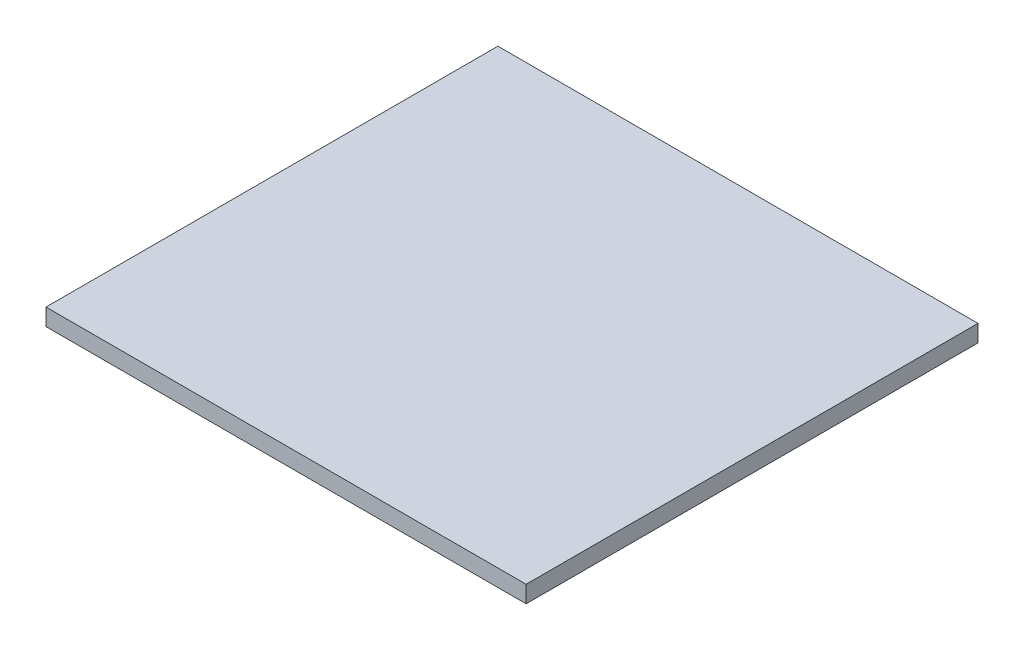
ISO-10303-21;
HEADER;
FILE_DESCRIPTION(('STEP AP214'),'2;1');
FILE_NAME('part.step','',(''),(''),'','','');
FILE_SCHEMA(('AUTOMOTIVE_DESIGN { 1 0 10303 214 1 1 1 1 }'));
ENDSEC;
DATA;
#1=APPLICATION_CONTEXT('core data for automotive mechanical design processes');
#2=APPLICATION_PROTOCOL_DEFINITION('international standard','automotive_design',2000,#1);
#3=PRODUCT_CONTEXT('',#1,'mechanical');
#4=PRODUCT('Part','Part','',(#3));
#5=PRODUCT_RELATED_PRODUCT_CATEGORY('part','',(#4));
#6=PRODUCT_DEFINITION_FORMATION('','',#4);
#7=PRODUCT_DEFINITION_CONTEXT('part definition',#1,'design');
#8=PRODUCT_DEFINITION('design','',#6,#7);
#9=PRODUCT_DEFINITION_SHAPE('','',#8);
#10=(LENGTH_UNIT() NAMED_UNIT(*) SI_UNIT(.MILLI.,.METRE.));
#11=(NAMED_UNIT(*) PLANE_ANGLE_UNIT() SI_UNIT($,.RADIAN.));
#12=(NAMED_UNIT(*) SI_UNIT($,.STERADIAN.) SOLID_ANGLE_UNIT());
#13=UNCERTAINTY_MEASURE_WITH_UNIT(LENGTH_MEASURE(1.E-05),#10,'distance_accuracy_value','');
#14=(GEOMETRIC_REPRESENTATION_CONTEXT(3) GLOBAL_UNCERTAINTY_ASSIGNED_CONTEXT((#13)) GLOBAL_UNIT_ASSIGNED_CONTEXT((#10,
#11,#12)) REPRESENTATION_CONTEXT('',''));
#15=CARTESIAN_POINT('',(0.,0.,0.));
#16=DIRECTION('',(0.,0.,1.));
#17=DIRECTION('',(1.,0.,0.));
#18=AXIS2_PLACEMENT_3D('',#15,#16,#17);
#19=CARTESIAN_POINT('',(-42.5,3.,-40.));
#20=DIRECTION('',(1.,0.,0.));
#21=DIRECTION('',(0.,0.,-1.));
#22=AXIS2_PLACEMENT_3D('',#19,#20,#21);
#23=PLANE('',#22);
#24=DIRECTION('',(0.,0.,1.));
#25=VECTOR('',#24,1.);
#26=CARTESIAN_POINT('',(-42.5,0.,-40.));
#27=LINE('',#26,#25);
#28=CARTESIAN_POINT('',(-42.5,0.,-40.));
#29=VERTEX_POINT('',#28);
#30=CARTESIAN_POINT('',(-42.5,0.,40.));
#31=VERTEX_POINT('',#30);
#32=EDGE_CURVE('E100',#29,#31,#27,.T.);
#33=ORIENTED_EDGE('',*,*,#32,.T.);
#34=DIRECTION('',(0.,-1.,0.));
#35=VECTOR('',#34,1.);
#36=CARTESIAN_POINT('',(-42.5,3.,40.));
#37=LINE('',#36,#35);
#38=CARTESIAN_POINT('',(-42.5,3.,40.));
#39=VERTEX_POINT('',#38);
#40=EDGE_CURVE('E11',#39,#31,#37,.T.);
#41=ORIENTED_EDGE('',*,*,#40,.F.);
#42=DIRECTION('',(0.,0.,1.));
#43=VECTOR('',#42,1.);
#44=CARTESIAN_POINT('',(-42.5,3.,-40.));
#45=LINE('',#44,#43);
#46=CARTESIAN_POINT('',(-42.5,3.,-40.));
#47=VERTEX_POINT('',#46);
#48=EDGE_CURVE('E88',#47,#39,#45,.T.);
#49=ORIENTED_EDGE('',*,*,#48,.F.);
#50=DIRECTION('',(0.,-1.,0.));
#51=VECTOR('',#50,1.);
#52=CARTESIAN_POINT('',(-42.5,3.,-40.));
#53=LINE('',#52,#51);
#54=EDGE_CURVE('E96',#47,#29,#53,.T.);
#55=ORIENTED_EDGE('',*,*,#54,.T.);
#56=EDGE_LOOP('',(#33,#41,#49,#55));
#57=FACE_BOUND('',#56,.T.);
#58=ADVANCED_FACE('F37',(#57),#23,.F.);
#59=CARTESIAN_POINT('',(42.5,3.,40.));
#60=DIRECTION('',(0.,0.,-1.));
#61=DIRECTION('',(-1.,0.,0.));
#62=AXIS2_PLACEMENT_3D('',#59,#60,#61);
#63=PLANE('',#62);
#64=DIRECTION('',(1.,0.,0.));
#65=VECTOR('',#64,1.);
#66=CARTESIAN_POINT('',(42.5,0.,40.));
#67=LINE('',#66,#65);
#68=CARTESIAN_POINT('',(42.5,0.,40.));
#69=VERTEX_POINT('',#68);
#70=EDGE_CURVE('E92',#31,#69,#67,.T.);
#71=ORIENTED_EDGE('',*,*,#70,.T.);
#72=DIRECTION('',(0.,-1.,0.));
#73=VECTOR('',#72,1.);
#74=CARTESIAN_POINT('',(42.5,3.,40.));
#75=LINE('',#74,#73);
#76=CARTESIAN_POINT('',(42.5,3.,40.));
#77=VERTEX_POINT('',#76);
#78=EDGE_CURVE('E45',#77,#69,#75,.T.);
#79=ORIENTED_EDGE('',*,*,#78,.F.);
#80=DIRECTION('',(1.,0.,0.));
#81=VECTOR('',#80,1.);
#82=CARTESIAN_POINT('',(42.5,3.,40.));
#83=LINE('',#82,#81);
#84=EDGE_CURVE('E83',#39,#77,#83,.T.);
#85=ORIENTED_EDGE('',*,*,#84,.F.);
#86=ORIENTED_EDGE('',*,*,#40,.T.);
#87=EDGE_LOOP('',(#71,#79,#85,#86));
#88=FACE_BOUND('',#87,.T.);
#89=ADVANCED_FACE('F91',(#88),#63,.F.);
#90=CARTESIAN_POINT('',(42.5,3.,-40.));
#91=DIRECTION('',(-1.,0.,0.));
#92=DIRECTION('',(0.,0.,1.));
#93=AXIS2_PLACEMENT_3D('',#90,#91,#92);
#94=PLANE('',#93);
#95=DIRECTION('',(0.,0.,-1.));
#96=VECTOR('',#95,1.);
#97=CARTESIAN_POINT('',(42.5,0.,-40.));
#98=LINE('',#97,#96);
#99=CARTESIAN_POINT('',(42.5,0.,-40.));
#100=VERTEX_POINT('',#99);
#101=EDGE_CURVE('E70',#69,#100,#98,.T.);
#102=ORIENTED_EDGE('',*,*,#101,.T.);
#103=DIRECTION('',(0.,-1.,0.));
#104=VECTOR('',#103,1.);
#105=CARTESIAN_POINT('',(42.5,3.,-40.));
#106=LINE('',#105,#104);
#107=CARTESIAN_POINT('',(42.5,3.,-40.));
#108=VERTEX_POINT('',#107);
#109=EDGE_CURVE('E93',#108,#100,#106,.T.);
#110=ORIENTED_EDGE('',*,*,#109,.F.);
#111=DIRECTION('',(0.,0.,-1.));
#112=VECTOR('',#111,1.);
#113=CARTESIAN_POINT('',(42.5,3.,-40.));
#114=LINE('',#113,#112);
#115=EDGE_CURVE('E86',#77,#108,#114,.T.);
#116=ORIENTED_EDGE('',*,*,#115,.F.);
#117=ORIENTED_EDGE('',*,*,#78,.T.);
#118=EDGE_LOOP('',(#102,#110,#116,#117));
#119=FACE_BOUND('',#118,.T.);
#120=ADVANCED_FACE('F94',(#119),#94,.F.);
#121=CARTESIAN_POINT('',(42.5,3.,-40.));
#122=DIRECTION('',(0.,0.,1.));
#123=DIRECTION('',(1.,0.,0.));
#124=AXIS2_PLACEMENT_3D('',#121,#122,#123);
#125=PLANE('',#124);
#126=DIRECTION('',(-1.,0.,0.));
#127=VECTOR('',#126,1.);
#128=CARTESIAN_POINT('',(42.5,0.,-40.));
#129=LINE('',#128,#127);
#130=EDGE_CURVE('E76',#100,#29,#129,.T.);
#131=ORIENTED_EDGE('',*,*,#130,.T.);
#132=ORIENTED_EDGE('',*,*,#54,.F.);
#133=DIRECTION('',(-1.,0.,0.));
#134=VECTOR('',#133,1.);
#135=CARTESIAN_POINT('',(42.5,3.,-40.));
#136=LINE('',#135,#134);
#137=EDGE_CURVE('E53',#108,#47,#136,.T.);
#138=ORIENTED_EDGE('',*,*,#137,.F.);
#139=ORIENTED_EDGE('',*,*,#109,.T.);
#140=EDGE_LOOP('',(#131,#132,#138,#139));
#141=FACE_BOUND('',#140,.T.);
#142=ADVANCED_FACE('F107',(#141),#125,.F.);
#143=CARTESIAN_POINT('',(0.,3.,0.));
#144=DIRECTION('',(0.,-1.,0.));
#145=DIRECTION('',(0.,0.,-1.));
#146=AXIS2_PLACEMENT_3D('',#143,#144,#145);
#147=PLANE('',#146);
#148=ORIENTED_EDGE('',*,*,#48,.T.);
#149=ORIENTED_EDGE('',*,*,#84,.T.);
#150=ORIENTED_EDGE('',*,*,#115,.T.);
#151=ORIENTED_EDGE('',*,*,#137,.T.);
#152=EDGE_LOOP('',(#148,#149,#150,#151));
#153=FACE_BOUND('',#152,.T.);
#154=ADVANCED_FACE('F84',(#153),#147,.F.);
#155=CARTESIAN_POINT('',(0.,0.,0.));
#156=DIRECTION('',(0.,-1.,0.));
#157=DIRECTION('',(0.,0.,-1.));
#158=AXIS2_PLACEMENT_3D('',#155,#156,#157);
#159=PLANE('',#158);
#160=ORIENTED_EDGE('',*,*,#32,.F.);
#161=ORIENTED_EDGE('',*,*,#130,.F.);
#162=ORIENTED_EDGE('',*,*,#101,.F.);
#163=ORIENTED_EDGE('',*,*,#70,.F.);
#164=EDGE_LOOP('',(#160,#161,#162,#163));
#165=FACE_BOUND('',#164,.T.);
#166=ADVANCED_FACE('F110',(#165),#159,.T.);
#167=CLOSED_SHELL('',(#58,#89,#120,#142,#154,#166));
#168=MANIFOLD_SOLID_BREP('B2',#167);
#169=ADVANCED_BREP_SHAPE_REPRESENTATION('',(#18,#168),#14);
#170=SHAPE_DEFINITION_REPRESENTATION(#9,#169);
ENDSEC;
END-ISO-10303-21;
